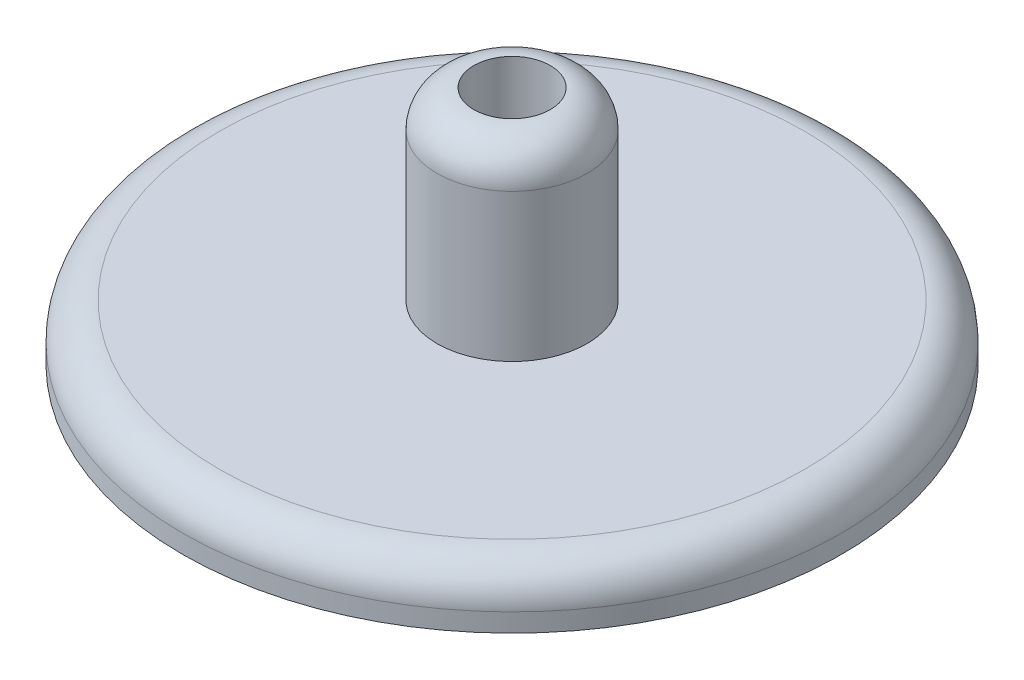
ISO-10303-21;
HEADER;
FILE_DESCRIPTION(('STEP AP214'),'2;1');
FILE_NAME('part.step','',(''),(''),'','','');
FILE_SCHEMA(('AUTOMOTIVE_DESIGN { 1 0 10303 214 1 1 1 1 }'));
ENDSEC;
DATA;
#1=APPLICATION_CONTEXT('core data for automotive mechanical design processes');
#2=APPLICATION_PROTOCOL_DEFINITION('international standard','automotive_design',2000,#1);
#3=PRODUCT_CONTEXT('',#1,'mechanical');
#4=PRODUCT('Part','Part','',(#3));
#5=PRODUCT_RELATED_PRODUCT_CATEGORY('part','',(#4));
#6=PRODUCT_DEFINITION_FORMATION('','',#4);
#7=PRODUCT_DEFINITION_CONTEXT('part definition',#1,'design');
#8=PRODUCT_DEFINITION('design','',#6,#7);
#9=PRODUCT_DEFINITION_SHAPE('','',#8);
#10=(LENGTH_UNIT() NAMED_UNIT(*) SI_UNIT(.MILLI.,.METRE.));
#11=(NAMED_UNIT(*) PLANE_ANGLE_UNIT() SI_UNIT($,.RADIAN.));
#12=(NAMED_UNIT(*) SI_UNIT($,.STERADIAN.) SOLID_ANGLE_UNIT());
#13=UNCERTAINTY_MEASURE_WITH_UNIT(LENGTH_MEASURE(1.E-05),#10,'distance_accuracy_value','');
#14=(GEOMETRIC_REPRESENTATION_CONTEXT(3) GLOBAL_UNCERTAINTY_ASSIGNED_CONTEXT((#13)) GLOBAL_UNIT_ASSIGNED_CONTEXT((#10,
#11,#12)) REPRESENTATION_CONTEXT('',''));
#15=CARTESIAN_POINT('',(0.,0.,0.));
#16=DIRECTION('',(0.,0.,1.));
#17=DIRECTION('',(1.,0.,0.));
#18=AXIS2_PLACEMENT_3D('',#15,#16,#17);
#19=CARTESIAN_POINT('',(-18.1788966855767,3.,-33.9075942526626));
#20=DIRECTION('',(0.,-1.,0.));
#21=DIRECTION('',(0.,0.,-1.));
#22=AXIS2_PLACEMENT_3D('',#19,#20,#21);
#23=CYLINDRICAL_SURFACE('',#22,17.89);
#24=CARTESIAN_POINT('',(-18.1788966855767,1.,-33.9075942526626));
#25=DIRECTION('',(0.,1.,0.));
#26=DIRECTION('',(0.,0.,1.));
#27=AXIS2_PLACEMENT_3D('',#24,#25,#26);
#28=CIRCLE('',#27,17.89);
#29=CARTESIAN_POINT('',(-18.1788966855767,1.,-16.0175942526626));
#30=VERTEX_POINT('',#29);
#31=EDGE_CURVE('E53',#30,#30,#28,.F.);
#32=ORIENTED_EDGE('',*,*,#31,.T.);
#33=EDGE_LOOP('',(#32));
#34=FACE_BOUND('',#33,.T.);
#35=CARTESIAN_POINT('',(-18.1788966855767,0.,-33.9075942526626));
#36=DIRECTION('',(0.,1.,0.));
#37=DIRECTION('',(0.,0.,1.));
#38=AXIS2_PLACEMENT_3D('',#35,#36,#37);
#39=CIRCLE('',#38,17.89);
#40=CARTESIAN_POINT('',(-18.1788966855767,0.,-16.0175942526626));
#41=VERTEX_POINT('',#40);
#42=EDGE_CURVE('E70',#41,#41,#39,.T.);
#43=ORIENTED_EDGE('',*,*,#42,.T.);
#44=EDGE_LOOP('',(#43));
#45=FACE_BOUND('',#44,.T.);
#46=ADVANCED_FACE('F45',(#34,#45),#23,.T.);
#47=CARTESIAN_POINT('',(0.,3.,0.));
#48=DIRECTION('',(0.,1.,0.));
#49=DIRECTION('',(0.,0.,1.));
#50=AXIS2_PLACEMENT_3D('',#47,#48,#49);
#51=PLANE('',#50);
#52=CARTESIAN_POINT('',(-18.1788966855767,3.,-33.9075942526626));
#53=DIRECTION('',(0.,1.,0.));
#54=DIRECTION('',(0.,0.,1.));
#55=AXIS2_PLACEMENT_3D('',#52,#53,#54);
#56=CIRCLE('',#55,15.89);
#57=CARTESIAN_POINT('',(-18.1788966855767,3.,-18.0175942526626));
#58=VERTEX_POINT('',#57);
#59=EDGE_CURVE('E58',#58,#58,#56,.T.);
#60=ORIENTED_EDGE('',*,*,#59,.T.);
#61=EDGE_LOOP('',(#60));
#62=FACE_BOUND('',#61,.T.);
#63=CARTESIAN_POINT('',(-18.1788966855767,3.,-33.9075942526626));
#64=DIRECTION('',(0.,1.,0.));
#65=DIRECTION('',(0.,0.,1.));
#66=AXIS2_PLACEMENT_3D('',#63,#64,#65);
#67=CIRCLE('',#66,4.075);
#68=CARTESIAN_POINT('',(-18.1788966855767,3.,-29.8325942526626));
#69=VERTEX_POINT('',#68);
#70=EDGE_CURVE('E69',#69,#69,#67,.T.);
#71=ORIENTED_EDGE('',*,*,#70,.F.);
#72=EDGE_LOOP('',(#71));
#73=FACE_BOUND('',#72,.T.);
#74=ADVANCED_FACE('F94',(#62,#73),#51,.T.);
#75=CARTESIAN_POINT('',(0.,0.,0.));
#76=DIRECTION('',(0.,1.,0.));
#77=DIRECTION('',(0.,0.,1.));
#78=AXIS2_PLACEMENT_3D('',#75,#76,#77);
#79=PLANE('',#78);
#80=ORIENTED_EDGE('',*,*,#42,.F.);
#81=EDGE_LOOP('',(#80));
#82=FACE_BOUND('',#81,.T.);
#83=ADVANCED_FACE('F99',(#82),#79,.F.);
#84=CARTESIAN_POINT('',(-18.1788966855767,8.,-33.9075942526626));
#85=DIRECTION('',(0.,-1.,0.));
#86=DIRECTION('',(0.,0.,-1.));
#87=AXIS2_PLACEMENT_3D('',#84,#85,#86);
#88=CYLINDRICAL_SURFACE('',#87,4.075);
#89=CARTESIAN_POINT('',(-18.1788966855767,11.,-33.9075942526626));
#90=DIRECTION('',(0.,1.,0.));
#91=DIRECTION('',(0.,0.,1.));
#92=AXIS2_PLACEMENT_3D('',#89,#90,#91);
#93=CIRCLE('',#92,4.075);
#94=CARTESIAN_POINT('',(-18.1788966855767,11.,-29.8325942526626));
#95=VERTEX_POINT('',#94);
#96=EDGE_CURVE('E11',#95,#95,#93,.F.);
#97=ORIENTED_EDGE('',*,*,#96,.T.);
#98=EDGE_LOOP('',(#97));
#99=FACE_BOUND('',#98,.T.);
#100=ORIENTED_EDGE('',*,*,#70,.T.);
#101=EDGE_LOOP('',(#100));
#102=FACE_BOUND('',#101,.T.);
#103=ADVANCED_FACE('F105',(#99,#102),#88,.T.);
#104=CARTESIAN_POINT('',(-18.1788966855767,13.,-33.9075942526626));
#105=DIRECTION('',(0.,-1.,0.));
#106=DIRECTION('',(0.,0.,-1.));
#107=AXIS2_PLACEMENT_3D('',#104,#105,#106);
#108=CYLINDRICAL_SURFACE('',#107,2.075);
#109=CARTESIAN_POINT('',(-18.1788966855767,13.,-33.9075942526626));
#110=DIRECTION('',(0.,1.,0.));
#111=DIRECTION('',(0.,0.,1.));
#112=AXIS2_PLACEMENT_3D('',#109,#110,#111);
#113=CIRCLE('',#112,2.075);
#114=CARTESIAN_POINT('',(-18.1788966855767,13.,-31.8325942526626));
#115=VERTEX_POINT('',#114);
#116=EDGE_CURVE('E74',#115,#115,#113,.T.);
#117=ORIENTED_EDGE('',*,*,#116,.T.);
#118=EDGE_LOOP('',(#117));
#119=FACE_BOUND('',#118,.T.);
#120=CARTESIAN_POINT('',(-18.1788966855767,8.,-33.9075942526626));
#121=DIRECTION('',(0.,1.,0.));
#122=DIRECTION('',(0.,0.,1.));
#123=AXIS2_PLACEMENT_3D('',#120,#121,#122);
#124=CIRCLE('',#123,2.075);
#125=CARTESIAN_POINT('',(-18.1788966855767,8.,-31.8325942526626));
#126=VERTEX_POINT('',#125);
#127=EDGE_CURVE('E63',#126,#126,#124,.F.);
#128=ORIENTED_EDGE('',*,*,#127,.T.);
#129=EDGE_LOOP('',(#128));
#130=FACE_BOUND('',#129,.T.);
#131=ADVANCED_FACE('F82',(#119,#130),#108,.F.);
#132=CARTESIAN_POINT('',(-18.1788966855767,8.,-33.9075942526626));
#133=DIRECTION('',(0.,1.,0.));
#134=DIRECTION('',(0.,0.,1.));
#135=AXIS2_PLACEMENT_3D('',#132,#133,#134);
#136=PLANE('',#135);
#137=ORIENTED_EDGE('',*,*,#127,.F.);
#138=EDGE_LOOP('',(#137));
#139=FACE_BOUND('',#138,.T.);
#140=ADVANCED_FACE('F91',(#139),#136,.T.);
#141=CARTESIAN_POINT('',(-18.1788966855767,1.,-33.9075942526626));
#142=DIRECTION('',(0.,1.,0.));
#143=DIRECTION('',(0.,0.,1.));
#144=AXIS2_PLACEMENT_3D('',#141,#142,#143);
#145=TOROIDAL_SURFACE('',#144,15.89,2.);
#146=ORIENTED_EDGE('',*,*,#31,.F.);
#147=EDGE_LOOP('',(#146));
#148=FACE_BOUND('',#147,.T.);
#149=ORIENTED_EDGE('',*,*,#59,.F.);
#150=EDGE_LOOP('',(#149));
#151=FACE_BOUND('',#150,.T.);
#152=ADVANCED_FACE('F86',(#148,#151),#145,.T.);
#153=CARTESIAN_POINT('',(-18.1788966855767,11.,-33.9075942526626));
#154=DIRECTION('',(0.,1.,0.));
#155=DIRECTION('',(0.,0.,1.));
#156=AXIS2_PLACEMENT_3D('',#153,#154,#155);
#157=TOROIDAL_SURFACE('',#156,2.075,2.);
#158=ORIENTED_EDGE('',*,*,#96,.F.);
#159=EDGE_LOOP('',(#158));
#160=FACE_BOUND('',#159,.T.);
#161=ORIENTED_EDGE('',*,*,#116,.F.);
#162=EDGE_LOOP('',(#161));
#163=FACE_BOUND('',#162,.T.);
#164=ADVANCED_FACE('F47',(#160,#163),#157,.T.);
#165=CLOSED_SHELL('',(#46,#74,#83,#103,#131,#140,#152,#164));
#166=MANIFOLD_SOLID_BREP('B2',#165);
#167=ADVANCED_BREP_SHAPE_REPRESENTATION('',(#18,#166),#14);
#168=SHAPE_DEFINITION_REPRESENTATION(#9,#167);
ENDSEC;
END-ISO-10303-21;
